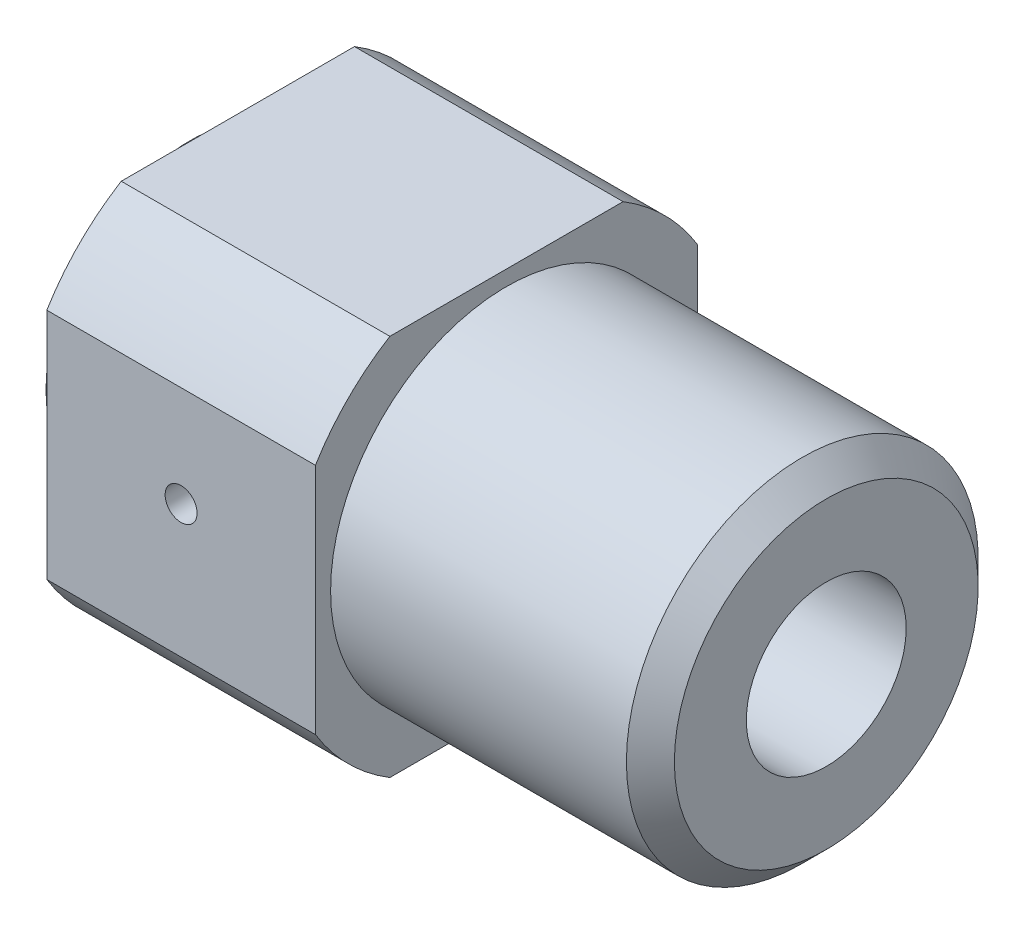
ISO-10303-21;
HEADER;
FILE_DESCRIPTION(('STEP AP214'),'2;1');
FILE_NAME('part.step','',(''),(''),'','','');
FILE_SCHEMA(('AUTOMOTIVE_DESIGN { 1 0 10303 214 1 1 1 1 }'));
ENDSEC;
DATA;
#1=APPLICATION_CONTEXT('core data for automotive mechanical design processes');
#2=APPLICATION_PROTOCOL_DEFINITION('international standard','automotive_design',2000,#1);
#3=PRODUCT_CONTEXT('',#1,'mechanical');
#4=PRODUCT('Part','Part','',(#3));
#5=PRODUCT_RELATED_PRODUCT_CATEGORY('part','',(#4));
#6=PRODUCT_DEFINITION_FORMATION('','',#4);
#7=PRODUCT_DEFINITION_CONTEXT('part definition',#1,'design');
#8=PRODUCT_DEFINITION('design','',#6,#7);
#9=PRODUCT_DEFINITION_SHAPE('','',#8);
#10=(LENGTH_UNIT() NAMED_UNIT(*) SI_UNIT(.MILLI.,.METRE.));
#11=(NAMED_UNIT(*) PLANE_ANGLE_UNIT() SI_UNIT($,.RADIAN.));
#12=(NAMED_UNIT(*) SI_UNIT($,.STERADIAN.) SOLID_ANGLE_UNIT());
#13=UNCERTAINTY_MEASURE_WITH_UNIT(LENGTH_MEASURE(1.E-05),#10,'distance_accuracy_value','');
#14=(GEOMETRIC_REPRESENTATION_CONTEXT(3) GLOBAL_UNCERTAINTY_ASSIGNED_CONTEXT((#13)) GLOBAL_UNIT_ASSIGNED_CONTEXT((#10,
#11,#12)) REPRESENTATION_CONTEXT('',''));
#15=CARTESIAN_POINT('',(0.,0.,0.));
#16=DIRECTION('',(0.,0.,1.));
#17=DIRECTION('',(1.,0.,0.));
#18=AXIS2_PLACEMENT_3D('',#15,#16,#17);
#19=CARTESIAN_POINT('',(0.,0.,-14.));
#20=DIRECTION('',(1.,0.,0.));
#21=DIRECTION('',(0.,0.,-1.));
#22=AXIS2_PLACEMENT_3D('',#19,#20,#21);
#23=PLANE('',#22);
#24=CARTESIAN_POINT('',(0.,0.,0.));
#25=DIRECTION('',(-1.,0.,0.));
#26=DIRECTION('',(0.,0.,1.));
#27=AXIS2_PLACEMENT_3D('',#24,#25,#26);
#28=CIRCLE('',#27,14.);
#29=CARTESIAN_POINT('',(0.,-11.95,7.29366163185543));
#30=VERTEX_POINT('',#29);
#31=CARTESIAN_POINT('',(0.,-7.29366163185544,11.95));
#32=VERTEX_POINT('',#31);
#33=EDGE_CURVE('E132',#30,#32,#28,.T.);
#34=ORIENTED_EDGE('',*,*,#33,.T.);
#35=DIRECTION('',(0.,-1.,0.));
#36=VECTOR('',#35,1.);
#37=CARTESIAN_POINT('',(0.,-11.95,11.95));
#38=LINE('',#37,#36);
#39=CARTESIAN_POINT('',(0.,7.29366163185543,11.95));
#40=VERTEX_POINT('',#39);
#41=EDGE_CURVE('E342',#40,#32,#38,.T.);
#42=ORIENTED_EDGE('',*,*,#41,.F.);
#43=CARTESIAN_POINT('',(0.,11.95,7.29366163185543));
#44=VERTEX_POINT('',#43);
#45=EDGE_CURVE('E123',#40,#44,#28,.T.);
#46=ORIENTED_EDGE('',*,*,#45,.T.);
#47=DIRECTION('',(0.,0.,1.));
#48=VECTOR('',#47,1.);
#49=CARTESIAN_POINT('',(0.,11.95,-11.95));
#50=LINE('',#49,#48);
#51=CARTESIAN_POINT('',(0.,11.95,-7.29366163185543));
#52=VERTEX_POINT('',#51);
#53=EDGE_CURVE('E103',#52,#44,#50,.T.);
#54=ORIENTED_EDGE('',*,*,#53,.F.);
#55=CARTESIAN_POINT('',(0.,7.29366163185543,-11.95));
#56=VERTEX_POINT('',#55);
#57=EDGE_CURVE('E120',#52,#56,#28,.T.);
#58=ORIENTED_EDGE('',*,*,#57,.T.);
#59=DIRECTION('',(0.,1.,0.));
#60=VECTOR('',#59,1.);
#61=CARTESIAN_POINT('',(0.,-11.95,-11.95));
#62=LINE('',#61,#60);
#63=CARTESIAN_POINT('',(0.,-7.29366163185543,-11.95));
#64=VERTEX_POINT('',#63);
#65=EDGE_CURVE('E124',#64,#56,#62,.T.);
#66=ORIENTED_EDGE('',*,*,#65,.F.);
#67=CARTESIAN_POINT('',(0.,-11.95,-7.29366163185544));
#68=VERTEX_POINT('',#67);
#69=EDGE_CURVE('E129',#64,#68,#28,.T.);
#70=ORIENTED_EDGE('',*,*,#69,.T.);
#71=DIRECTION('',(0.,0.,-1.));
#72=VECTOR('',#71,1.);
#73=CARTESIAN_POINT('',(0.,-11.95,-11.95));
#74=LINE('',#73,#72);
#75=EDGE_CURVE('E344',#30,#68,#74,.T.);
#76=ORIENTED_EDGE('',*,*,#75,.F.);
#77=EDGE_LOOP('',(#34,#42,#46,#54,#58,#66,#70,#76));
#78=FACE_BOUND('',#77,.T.);
#79=CARTESIAN_POINT('',(0.,0.,0.));
#80=DIRECTION('',(1.,0.,0.));
#81=DIRECTION('',(0.,0.,-1.));
#82=AXIS2_PLACEMENT_3D('',#79,#80,#81);
#83=CIRCLE('',#82,9.);
#84=CARTESIAN_POINT('',(0.,0.,-9.));
#85=VERTEX_POINT('',#84);
#86=EDGE_CURVE('E12',#85,#85,#83,.F.);
#87=ORIENTED_EDGE('',*,*,#86,.F.);
#88=EDGE_LOOP('',(#87));
#89=FACE_BOUND('',#88,.T.);
#90=ADVANCED_FACE('F37',(#78,#89),#23,.F.);
#91=CARTESIAN_POINT('',(0.,0.,0.));
#92=DIRECTION('',(-1.,0.,0.));
#93=DIRECTION('',(0.,0.,1.));
#94=AXIS2_PLACEMENT_3D('',#91,#92,#93);
#95=CYLINDRICAL_SURFACE('',#94,14.);
#96=CARTESIAN_POINT('',(16.8,0.,0.));
#97=DIRECTION('',(-1.,0.,0.));
#98=DIRECTION('',(0.,0.,1.));
#99=AXIS2_PLACEMENT_3D('',#96,#97,#98);
#100=CIRCLE('',#99,14.);
#101=CARTESIAN_POINT('',(16.8,-11.95,7.29366163185543));
#102=VERTEX_POINT('',#101);
#103=CARTESIAN_POINT('',(16.8,-7.29366163185544,11.95));
#104=VERTEX_POINT('',#103);
#105=EDGE_CURVE('E131',#102,#104,#100,.T.);
#106=ORIENTED_EDGE('',*,*,#105,.T.);
#107=DIRECTION('',(-1.,0.,0.));
#108=VECTOR('',#107,1.);
#109=CARTESIAN_POINT('',(0.,-7.29366163185544,11.95));
#110=LINE('',#109,#108);
#111=EDGE_CURVE('E44',#104,#32,#110,.T.);
#112=ORIENTED_EDGE('',*,*,#111,.T.);
#113=ORIENTED_EDGE('',*,*,#33,.F.);
#114=DIRECTION('',(-1.,0.,0.));
#115=VECTOR('',#114,1.);
#116=CARTESIAN_POINT('',(0.,-11.95,7.29366163185543));
#117=LINE('',#116,#115);
#118=EDGE_CURVE('E154',#30,#102,#117,.F.);
#119=ORIENTED_EDGE('',*,*,#118,.T.);
#120=EDGE_LOOP('',(#106,#112,#113,#119));
#121=FACE_BOUND('',#120,.T.);
#122=ADVANCED_FACE('F192',(#121),#95,.T.);
#123=CARTESIAN_POINT('',(16.8,-7.29366163185543,-11.95));
#124=VERTEX_POINT('',#123);
#125=CARTESIAN_POINT('',(16.8,-11.95,-7.29366163185544));
#126=VERTEX_POINT('',#125);
#127=EDGE_CURVE('E356',#124,#126,#100,.T.);
#128=ORIENTED_EDGE('',*,*,#127,.T.);
#129=DIRECTION('',(-1.,0.,0.));
#130=VECTOR('',#129,1.);
#131=CARTESIAN_POINT('',(0.,-11.95,-7.29366163185544));
#132=LINE('',#131,#130);
#133=EDGE_CURVE('E156',#126,#68,#132,.T.);
#134=ORIENTED_EDGE('',*,*,#133,.T.);
#135=ORIENTED_EDGE('',*,*,#69,.F.);
#136=DIRECTION('',(-1.,0.,0.));
#137=VECTOR('',#136,1.);
#138=CARTESIAN_POINT('',(0.,-7.29366163185543,-11.95));
#139=LINE('',#138,#137);
#140=EDGE_CURVE('E151',#64,#124,#139,.F.);
#141=ORIENTED_EDGE('',*,*,#140,.T.);
#142=EDGE_LOOP('',(#128,#134,#135,#141));
#143=FACE_BOUND('',#142,.T.);
#144=ADVANCED_FACE('F196',(#143),#95,.T.);
#145=CARTESIAN_POINT('',(16.8,11.95,-7.29366163185543));
#146=VERTEX_POINT('',#145);
#147=CARTESIAN_POINT('',(16.8,7.29366163185543,-11.95));
#148=VERTEX_POINT('',#147);
#149=EDGE_CURVE('E142',#146,#148,#100,.T.);
#150=ORIENTED_EDGE('',*,*,#149,.T.);
#151=DIRECTION('',(-1.,0.,0.));
#152=VECTOR('',#151,1.);
#153=CARTESIAN_POINT('',(0.,7.29366163185543,-11.95));
#154=LINE('',#153,#152);
#155=EDGE_CURVE('E128',#148,#56,#154,.T.);
#156=ORIENTED_EDGE('',*,*,#155,.T.);
#157=ORIENTED_EDGE('',*,*,#57,.F.);
#158=DIRECTION('',(-1.,0.,0.));
#159=VECTOR('',#158,1.);
#160=CARTESIAN_POINT('',(0.,11.95,-7.29366163185543));
#161=LINE('',#160,#159);
#162=EDGE_CURVE('E100',#52,#146,#161,.F.);
#163=ORIENTED_EDGE('',*,*,#162,.T.);
#164=EDGE_LOOP('',(#150,#156,#157,#163));
#165=FACE_BOUND('',#164,.T.);
#166=ADVANCED_FACE('F127',(#165),#95,.T.);
#167=CARTESIAN_POINT('',(36.8,0.,0.));
#168=DIRECTION('',(-1.,0.,0.));
#169=DIRECTION('',(0.,0.,1.));
#170=AXIS2_PLACEMENT_3D('',#167,#168,#169);
#171=PLANE('',#170);
#172=CARTESIAN_POINT('',(36.8,0.,0.));
#173=DIRECTION('',(1.,0.,0.));
#174=DIRECTION('',(0.,0.,-1.));
#175=AXIS2_PLACEMENT_3D('',#172,#173,#174);
#176=CIRCLE('',#175,5.);
#177=CARTESIAN_POINT('',(36.8,0.,-5.));
#178=VERTEX_POINT('',#177);
#179=EDGE_CURVE('E170',#178,#178,#176,.T.);
#180=ORIENTED_EDGE('',*,*,#179,.F.);
#181=EDGE_LOOP('',(#180));
#182=FACE_BOUND('',#181,.T.);
#183=CARTESIAN_POINT('',(36.8,0.,0.));
#184=DIRECTION('',(-1.,0.,0.));
#185=DIRECTION('',(0.,0.,1.));
#186=AXIS2_PLACEMENT_3D('',#183,#184,#185);
#187=CIRCLE('',#186,9.5);
#188=CARTESIAN_POINT('',(36.8,0.,9.5));
#189=VERTEX_POINT('',#188);
#190=EDGE_CURVE('E112',#189,#189,#187,.T.);
#191=ORIENTED_EDGE('',*,*,#190,.F.);
#192=EDGE_LOOP('',(#191));
#193=FACE_BOUND('',#192,.T.);
#194=ADVANCED_FACE('F218',(#182,#193),#171,.F.);
#195=CARTESIAN_POINT('',(36.8,0.,0.));
#196=DIRECTION('',(-1.,0.,0.));
#197=DIRECTION('',(0.,0.,1.));
#198=AXIS2_PLACEMENT_3D('',#195,#196,#197);
#199=CONICAL_SURFACE('',#198,9.5,0.785398163397449);
#200=CARTESIAN_POINT('',(35.3,0.,0.));
#201=DIRECTION('',(-1.,0.,0.));
#202=DIRECTION('',(0.,0.,1.));
#203=AXIS2_PLACEMENT_3D('',#200,#201,#202);
#204=CIRCLE('',#203,11.);
#205=CARTESIAN_POINT('',(35.3,0.,11.));
#206=VERTEX_POINT('',#205);
#207=EDGE_CURVE('E145',#206,#206,#204,.T.);
#208=ORIENTED_EDGE('',*,*,#207,.F.);
#209=EDGE_LOOP('',(#208));
#210=FACE_BOUND('',#209,.T.);
#211=ORIENTED_EDGE('',*,*,#190,.T.);
#212=EDGE_LOOP('',(#211));
#213=FACE_BOUND('',#212,.T.);
#214=ADVANCED_FACE('F222',(#210,#213),#199,.T.);
#215=CARTESIAN_POINT('',(0.,0.,0.));
#216=DIRECTION('',(-1.,0.,0.));
#217=DIRECTION('',(0.,0.,1.));
#218=AXIS2_PLACEMENT_3D('',#215,#216,#217);
#219=CYLINDRICAL_SURFACE('',#218,11.);
#220=CARTESIAN_POINT('',(16.8,0.,0.));
#221=DIRECTION('',(-1.,0.,0.));
#222=DIRECTION('',(0.,0.,1.));
#223=AXIS2_PLACEMENT_3D('',#220,#221,#222);
#224=CIRCLE('',#223,11.);
#225=CARTESIAN_POINT('',(16.8,0.,11.));
#226=VERTEX_POINT('',#225);
#227=EDGE_CURVE('E141',#226,#226,#224,.T.);
#228=ORIENTED_EDGE('',*,*,#227,.F.);
#229=EDGE_LOOP('',(#228));
#230=FACE_BOUND('',#229,.T.);
#231=ORIENTED_EDGE('',*,*,#207,.T.);
#232=EDGE_LOOP('',(#231));
#233=FACE_BOUND('',#232,.T.);
#234=ADVANCED_FACE('F215',(#230,#233),#219,.T.);
#235=CARTESIAN_POINT('',(16.8,0.,-11.));
#236=DIRECTION('',(-1.,0.,0.));
#237=DIRECTION('',(0.,0.,1.));
#238=AXIS2_PLACEMENT_3D('',#235,#236,#237);
#239=PLANE('',#238);
#240=CARTESIAN_POINT('',(16.8,7.29366163185544,11.95));
#241=VERTEX_POINT('',#240);
#242=CARTESIAN_POINT('',(16.8,11.95,7.29366163185543));
#243=VERTEX_POINT('',#242);
#244=EDGE_CURVE('E138',#241,#243,#100,.T.);
#245=ORIENTED_EDGE('',*,*,#244,.F.);
#246=DIRECTION('',(0.,-1.,0.));
#247=VECTOR('',#246,1.);
#248=CARTESIAN_POINT('',(16.8,0.,11.95));
#249=LINE('',#248,#247);
#250=EDGE_CURVE('E136',#241,#104,#249,.T.);
#251=ORIENTED_EDGE('',*,*,#250,.T.);
#252=ORIENTED_EDGE('',*,*,#105,.F.);
#253=DIRECTION('',(0.,0.,-1.));
#254=VECTOR('',#253,1.);
#255=CARTESIAN_POINT('',(16.8,-11.95,-11.));
#256=LINE('',#255,#254);
#257=EDGE_CURVE('E51',#102,#126,#256,.T.);
#258=ORIENTED_EDGE('',*,*,#257,.T.);
#259=ORIENTED_EDGE('',*,*,#127,.F.);
#260=DIRECTION('',(0.,1.,0.));
#261=VECTOR('',#260,1.);
#262=CARTESIAN_POINT('',(16.8,0.,-11.95));
#263=LINE('',#262,#261);
#264=EDGE_CURVE('E59',#124,#148,#263,.T.);
#265=ORIENTED_EDGE('',*,*,#264,.T.);
#266=ORIENTED_EDGE('',*,*,#149,.F.);
#267=DIRECTION('',(0.,0.,1.));
#268=VECTOR('',#267,1.);
#269=CARTESIAN_POINT('',(16.8,11.95,-11.));
#270=LINE('',#269,#268);
#271=EDGE_CURVE('E106',#146,#243,#270,.T.);
#272=ORIENTED_EDGE('',*,*,#271,.T.);
#273=EDGE_LOOP('',(#245,#251,#252,#258,#259,#265,#266,#272));
#274=FACE_BOUND('',#273,.T.);
#275=ORIENTED_EDGE('',*,*,#227,.T.);
#276=EDGE_LOOP('',(#275));
#277=FACE_BOUND('',#276,.T.);
#278=ADVANCED_FACE('F208',(#274,#277),#239,.F.);
#279=ORIENTED_EDGE('',*,*,#45,.F.);
#280=DIRECTION('',(-1.,0.,0.));
#281=VECTOR('',#280,1.);
#282=CARTESIAN_POINT('',(0.,7.29366163185544,11.95));
#283=LINE('',#282,#281);
#284=EDGE_CURVE('E159',#40,#241,#283,.F.);
#285=ORIENTED_EDGE('',*,*,#284,.T.);
#286=ORIENTED_EDGE('',*,*,#244,.T.);
#287=DIRECTION('',(-1.,0.,0.));
#288=VECTOR('',#287,1.);
#289=CARTESIAN_POINT('',(0.,11.95,7.29366163185543));
#290=LINE('',#289,#288);
#291=EDGE_CURVE('E111',#243,#44,#290,.T.);
#292=ORIENTED_EDGE('',*,*,#291,.T.);
#293=EDGE_LOOP('',(#279,#285,#286,#292));
#294=FACE_BOUND('',#293,.T.);
#295=ADVANCED_FACE('F199',(#294),#95,.T.);
#296=CARTESIAN_POINT('',(36.8,11.95,-11.95));
#297=DIRECTION('',(0.,-1.,0.));
#298=DIRECTION('',(0.,0.,-1.));
#299=AXIS2_PLACEMENT_3D('',#296,#297,#298);
#300=PLANE('',#299);
#301=ORIENTED_EDGE('',*,*,#271,.F.);
#302=ORIENTED_EDGE('',*,*,#162,.F.);
#303=ORIENTED_EDGE('',*,*,#53,.T.);
#304=ORIENTED_EDGE('',*,*,#291,.F.);
#305=EDGE_LOOP('',(#301,#302,#303,#304));
#306=FACE_BOUND('',#305,.T.);
#307=ADVANCED_FACE('F102',(#306),#300,.F.);
#308=CARTESIAN_POINT('',(36.8,-11.95,-11.95));
#309=DIRECTION('',(0.,0.,1.));
#310=DIRECTION('',(1.,0.,0.));
#311=AXIS2_PLACEMENT_3D('',#308,#309,#310);
#312=PLANE('',#311);
#313=ORIENTED_EDGE('',*,*,#264,.F.);
#314=ORIENTED_EDGE('',*,*,#140,.F.);
#315=ORIENTED_EDGE('',*,*,#65,.T.);
#316=ORIENTED_EDGE('',*,*,#155,.F.);
#317=EDGE_LOOP('',(#313,#314,#315,#316));
#318=FACE_BOUND('',#317,.T.);
#319=ADVANCED_FACE('F214',(#318),#312,.F.);
#320=CARTESIAN_POINT('',(36.8,-11.95,-11.95));
#321=DIRECTION('',(0.,1.,0.));
#322=DIRECTION('',(0.,0.,1.));
#323=AXIS2_PLACEMENT_3D('',#320,#321,#322);
#324=PLANE('',#323);
#325=ORIENTED_EDGE('',*,*,#257,.F.);
#326=ORIENTED_EDGE('',*,*,#118,.F.);
#327=ORIENTED_EDGE('',*,*,#75,.T.);
#328=ORIENTED_EDGE('',*,*,#133,.F.);
#329=EDGE_LOOP('',(#325,#326,#327,#328));
#330=FACE_BOUND('',#329,.T.);
#331=ADVANCED_FACE('F271',(#330),#324,.F.);
#332=CARTESIAN_POINT('',(36.8,-11.95,11.95));
#333=DIRECTION('',(0.,0.,-1.));
#334=DIRECTION('',(-1.,0.,0.));
#335=AXIS2_PLACEMENT_3D('',#332,#333,#334);
#336=PLANE('',#335);
#337=CARTESIAN_POINT('',(8.4,0.993661631855429,11.95));
#338=DIRECTION('',(0.,0.,1.));
#339=DIRECTION('',(1.,0.,0.));
#340=AXIS2_PLACEMENT_3D('',#337,#338,#339);
#341=CIRCLE('',#340,1.);
#342=CARTESIAN_POINT('',(9.4,0.993661631855429,11.95));
#343=VERTEX_POINT('',#342);
#344=EDGE_CURVE('E171',#343,#343,#341,.T.);
#345=ORIENTED_EDGE('',*,*,#344,.F.);
#346=EDGE_LOOP('',(#345));
#347=FACE_BOUND('',#346,.T.);
#348=ORIENTED_EDGE('',*,*,#250,.F.);
#349=ORIENTED_EDGE('',*,*,#284,.F.);
#350=ORIENTED_EDGE('',*,*,#41,.T.);
#351=ORIENTED_EDGE('',*,*,#111,.F.);
#352=EDGE_LOOP('',(#348,#349,#350,#351));
#353=FACE_BOUND('',#352,.T.);
#354=ADVANCED_FACE('F279',(#347,#353),#336,.F.);
#355=CARTESIAN_POINT('',(0.,0.,0.));
#356=DIRECTION('',(1.,0.,0.));
#357=DIRECTION('',(0.,0.,-1.));
#358=AXIS2_PLACEMENT_3D('',#355,#356,#357);
#359=CYLINDRICAL_SURFACE('',#358,5.);
#360=CARTESIAN_POINT('',(9.4,0.993661631855429,4.90026902948995));
#361=CARTESIAN_POINT('',(9.39999756431983,1.0514606172551,4.88854726271471));
#362=CARTESIAN_POINT('',(9.3949722948974,1.10908577219185,4.87578751561889));
#363=CARTESIAN_POINT('',(9.37521162000695,1.22229469550526,4.84864897927689));
#364=CARTESIAN_POINT('',(9.36046396204121,1.27787579445287,4.8342681660888));
#365=CARTESIAN_POINT('',(9.32185192150122,1.38538158425215,4.80456268332733));
#366=CARTESIAN_POINT('',(9.29800405037564,1.43731269674229,4.78923976510529));
#367=CARTESIAN_POINT('',(9.24187670912188,1.53632438243894,4.75840300791234));
#368=CARTESIAN_POINT('',(9.20959795525854,1.5834053672255,4.74288918526679));
#369=CARTESIAN_POINT('',(9.13658750543368,1.67250453023335,4.71221799831036));
#370=CARTESIAN_POINT('',(9.09568645236189,1.71438953688841,4.69707583968247));
#371=CARTESIAN_POINT('',(9.00684123387658,1.79063647331835,4.66854174100717));
#372=CARTESIAN_POINT('',(8.95889734733502,1.82499870083529,4.65514973169954));
#373=CARTESIAN_POINT('',(8.85845640260946,1.88424024036918,4.63148296937744));
#374=CARTESIAN_POINT('',(8.80610446779291,1.90933663057014,4.6211381879904));
#375=CARTESIAN_POINT('',(8.69733313970971,1.95019803661392,4.60404431218998));
#376=CARTESIAN_POINT('',(8.64091640852385,1.96596909850924,4.5972928883168));
#377=CARTESIAN_POINT('',(8.53015745202352,1.98663352891745,4.58839887715911));
#378=CARTESIAN_POINT('',(8.47597440163615,1.99225055773703,4.5859500633337));
#379=CARTESIAN_POINT('',(8.36738643866649,1.99460261044718,4.58492785791618));
#380=CARTESIAN_POINT('',(8.31298159610255,1.99134024892286,4.58635332552051));
#381=CARTESIAN_POINT('',(8.20820918126398,1.9764556310684,4.59278587023713));
#382=CARTESIAN_POINT('',(8.15777252794768,1.96523735686504,4.59761980772518));
#383=CARTESIAN_POINT('',(8.05956864965689,1.93533149927297,4.61028780491874));
#384=CARTESIAN_POINT('',(8.01180176293101,1.91664297186752,4.6181222437927));
#385=CARTESIAN_POINT('',(7.91865736184497,1.8717636054529,4.63649692491475));
#386=CARTESIAN_POINT('',(7.87339658706958,1.84536201737043,4.6471121657962));
#387=CARTESIAN_POINT('',(7.78784638531251,1.78611222282873,4.67020476785574));
#388=CARTESIAN_POINT('',(7.74755858241133,1.75326191936356,4.6826827344416));
#389=CARTESIAN_POINT('',(7.66996035854561,1.67931583766708,4.70973001686622));
#390=CARTESIAN_POINT('',(7.63308900050508,1.63779049599584,4.72438571118182));
#391=CARTESIAN_POINT('',(7.56675399211425,1.54932339646399,4.75413237109986));
#392=CARTESIAN_POINT('',(7.53729264339788,1.50237996227077,4.76922347032556));
#393=CARTESIAN_POINT('',(7.48522296302018,1.4017619626845,4.79978722010109));
#394=CARTESIAN_POINT('',(7.46302271732342,1.34786994502596,4.81524215784731));
#395=CARTESIAN_POINT('',(7.42825089977698,1.23675022594681,4.84497205158466));
#396=CARTESIAN_POINT('',(7.41567896031719,1.179522651968,4.85924705260738));
#397=CARTESIAN_POINT('',(7.40078375283968,1.06388686084756,4.88586013592611));
#398=CARTESIAN_POINT('',(7.39836314358943,1.0054952776324,4.89821551576894));
#399=CARTESIAN_POINT('',(7.40380307613407,0.888767856225625,4.92073387716433));
#400=CARTESIAN_POINT('',(7.41166097983587,0.830432007574273,4.93089742049597));
#401=CARTESIAN_POINT('',(7.43708971320431,0.717993124313044,4.94849449488342));
#402=CARTESIAN_POINT('',(7.45426085699493,0.663814056648048,4.95602070433445));
#403=CARTESIAN_POINT('',(7.49765076529041,0.558937857514148,4.96894165113737));
#404=CARTESIAN_POINT('',(7.52386828628383,0.508240248633116,4.97433668122184));
#405=CARTESIAN_POINT('',(7.5838771297548,0.413120376463624,4.98312764324283));
#406=CARTESIAN_POINT('',(7.61746537766986,0.368574039429235,4.98656966274264));
#407=CARTESIAN_POINT('',(7.69162758661553,0.285633996381877,4.99200798381087));
#408=CARTESIAN_POINT('',(7.73220152342663,0.247240269038585,4.99400429039148));
#409=CARTESIAN_POINT('',(7.81919560506,0.17771592212093,4.99696224126323));
#410=CARTESIAN_POINT('',(7.86561653327772,0.146586277404955,4.9979237467439));
#411=CARTESIAN_POINT('',(7.96299625065261,0.0924787455216968,4.99921824075424));
#412=CARTESIAN_POINT('',(8.01395518182864,0.0695011135875697,4.99955120960632));
#413=CARTESIAN_POINT('',(8.11935337233081,0.0322127884175505,4.99993149372175));
#414=CARTESIAN_POINT('',(8.17381441563262,0.0179636255964945,4.99997680162348));
#415=CARTESIAN_POINT('',(8.28435399088734,-0.00121163989173685,5.00000916715531));
#416=CARTESIAN_POINT('',(8.34043254552003,-0.00613761177015912,4.99999622396825));
#417=CARTESIAN_POINT('',(8.45275101209759,-0.00652751250012111,4.99999575578908));
#418=CARTESIAN_POINT('',(8.50899100044093,-0.00196984455354585,5.00000828881165));
#419=CARTESIAN_POINT('',(8.61990838831726,0.0165221656367191,4.99998112289107));
#420=CARTESIAN_POINT('',(8.67458576575858,0.0304566403782175,4.99994142320986));
#421=CARTESIAN_POINT('',(8.78082892514576,0.067308055052593,4.9995806685692));
#422=CARTESIAN_POINT('',(8.83239447168897,0.0902256735585732,4.99925959235274));
#423=CARTESIAN_POINT('',(8.93093975856851,0.144389068797424,4.99798782519017));
#424=CARTESIAN_POINT('',(8.97791964369901,0.175634582457215,4.99703715413117));
#425=CARTESIAN_POINT('',(9.06586235106167,0.245481044345428,4.9940919936635));
#426=CARTESIAN_POINT('',(9.10683688863863,0.284067324608298,4.99209957218036));
#427=CARTESIAN_POINT('',(9.18171031872977,0.367506257720068,4.98665044307051));
#428=CARTESIAN_POINT('',(9.21560849578392,0.412359543434077,4.98319358748818));
#429=CARTESIAN_POINT('',(9.2751693985566,0.506661220759023,4.97448691328553));
#430=CARTESIAN_POINT('',(9.3008844971009,0.556077666631932,4.96924895973594));
#431=CARTESIAN_POINT('',(9.34369044306513,0.658236349046034,4.95674930195297));
#432=CARTESIAN_POINT('',(9.3607891395973,0.710975509299915,4.94948944896566));
#433=CARTESIAN_POINT('',(9.38227355920824,0.802246271545363,4.93536835787976));
#434=CARTESIAN_POINT('',(9.38892719168471,0.840342664766219,4.92902975208844));
#435=CARTESIAN_POINT('',(9.3977912278526,0.916872099565738,4.91536948159115));
#436=CARTESIAN_POINT('',(9.40000161636299,0.955305142294166,4.90804781352648));
#437=CARTESIAN_POINT('',(9.4,0.993661631855429,4.90026902948995));
#438=B_SPLINE_CURVE_WITH_KNOTS('',3,(#360,#361,#362,#363,#364,#365,#366,#367,#368,#369,#370,
#371,#372,#373,#374,#375,#376,#377,#378,#379,#380,#381,#382,#383,#384,#385,#386,#387,#388,#389,
#390,#391,#392,#393,#394,#395,#396,#397,#398,#399,#400,#401,#402,#403,#404,#405,#406,#407,#408,
#409,#410,#411,#412,#413,#414,#415,#416,#417,#418,#419,#420,#421,#422,#423,#424,#425,#426,#427,
#428,#429,#430,#431,#432,#433,#434,#435,#436,#437),.UNSPECIFIED.,.T.,.F.,(4,2,2,2,2,2,2,2,2,2,2,
2,2,2,2,2,2,2,2,2,2,2,2,2,2,2,2,2,2,2,2,2,2,2,2,2,2,2,4),(0.,0.176779037888811,
0.353781285942221,0.530463896068293,0.707131500601041,0.887661071724496,1.06818349642421,
1.24415838387448,1.42001905300274,1.58276148862029,1.74545600902103,1.90043142690105,
2.05542643523672,2.21513207425488,2.37488973295218,2.54643584251082,2.71803517063847,
2.8980701851512,3.07809832555847,3.25639616984989,3.43464826102175,3.60579446776385,
3.77691715818153,3.94381299044555,4.1107082440902,4.27762588263816,4.44454874678598,
4.61263516689994,4.78072394496736,4.94919592526914,5.1176702861934,5.28615737586953,
5.45463914377294,5.62278772979105,5.79095330835665,5.95801988570889,6.12493399737803,
6.24224747801459,6.35956135947022),.UNSPECIFIED.);
#439=CARTESIAN_POINT('',(9.4,0.993661631855429,4.90026902948995));
#440=VERTEX_POINT('',#439);
#441=EDGE_CURVE('E163',#440,#440,#438,.T.);
#442=ORIENTED_EDGE('',*,*,#441,.T.);
#443=EDGE_LOOP('',(#442));
#444=FACE_BOUND('',#443,.T.);
#445=ORIENTED_EDGE('',*,*,#179,.T.);
#446=EDGE_LOOP('',(#445));
#447=FACE_BOUND('',#446,.T.);
#448=CARTESIAN_POINT('',(-3.,0.,0.));
#449=DIRECTION('',(-1.,0.,0.));
#450=DIRECTION('',(0.,0.,1.));
#451=AXIS2_PLACEMENT_3D('',#448,#449,#450);
#452=CIRCLE('',#451,5.);
#453=CARTESIAN_POINT('',(-3.,0.,5.));
#454=VERTEX_POINT('',#453);
#455=EDGE_CURVE('E334',#454,#454,#452,.T.);
#456=ORIENTED_EDGE('',*,*,#455,.T.);
#457=EDGE_LOOP('',(#456));
#458=FACE_BOUND('',#457,.T.);
#459=ADVANCED_FACE('F172',(#444,#447,#458),#359,.F.);
#460=CARTESIAN_POINT('',(8.4,0.993661631855429,-1.05));
#461=DIRECTION('',(0.,0.,1.));
#462=DIRECTION('',(1.,0.,0.));
#463=AXIS2_PLACEMENT_3D('',#460,#461,#462);
#464=CYLINDRICAL_SURFACE('',#463,1.);
#465=ORIENTED_EDGE('',*,*,#344,.T.);
#466=EDGE_LOOP('',(#465));
#467=FACE_BOUND('',#466,.T.);
#468=ORIENTED_EDGE('',*,*,#441,.F.);
#469=EDGE_LOOP('',(#468));
#470=FACE_BOUND('',#469,.T.);
#471=ADVANCED_FACE('F175',(#467,#470),#464,.F.);
#472=CARTESIAN_POINT('',(-3.,0.,0.));
#473=DIRECTION('',(-1.,0.,0.));
#474=DIRECTION('',(0.,0.,1.));
#475=AXIS2_PLACEMENT_3D('',#472,#473,#474);
#476=PLANE('',#475);
#477=CARTESIAN_POINT('',(-3.,0.,0.));
#478=DIRECTION('',(-1.,0.,0.));
#479=DIRECTION('',(0.,0.,1.));
#480=AXIS2_PLACEMENT_3D('',#477,#478,#479);
#481=CIRCLE('',#480,9.);
#482=CARTESIAN_POINT('',(-3.,0.,9.));
#483=VERTEX_POINT('',#482);
#484=EDGE_CURVE('E335',#483,#483,#481,.T.);
#485=ORIENTED_EDGE('',*,*,#484,.T.);
#486=EDGE_LOOP('',(#485));
#487=FACE_BOUND('',#486,.T.);
#488=ORIENTED_EDGE('',*,*,#455,.F.);
#489=EDGE_LOOP('',(#488));
#490=FACE_BOUND('',#489,.T.);
#491=ADVANCED_FACE('F179',(#487,#490),#476,.T.);
#492=CARTESIAN_POINT('',(-3.,0.,0.));
#493=DIRECTION('',(1.,0.,0.));
#494=DIRECTION('',(0.,0.,-1.));
#495=AXIS2_PLACEMENT_3D('',#492,#493,#494);
#496=CYLINDRICAL_SURFACE('',#495,9.);
#497=ORIENTED_EDGE('',*,*,#484,.F.);
#498=EDGE_LOOP('',(#497));
#499=FACE_BOUND('',#498,.T.);
#500=ORIENTED_EDGE('',*,*,#86,.T.);
#501=EDGE_LOOP('',(#500));
#502=FACE_BOUND('',#501,.T.);
#503=ADVANCED_FACE('F181',(#499,#502),#496,.T.);
#504=CLOSED_SHELL('',(#90,#122,#144,#166,#194,#214,#234,#278,#295,#307,#319,#331,#354,#459,#471,
#491,#503));
#505=MANIFOLD_SOLID_BREP('B2',#504);
#506=ADVANCED_BREP_SHAPE_REPRESENTATION('',(#18,#505),#14);
#507=SHAPE_DEFINITION_REPRESENTATION(#9,#506);
ENDSEC;
END-ISO-10303-21;
